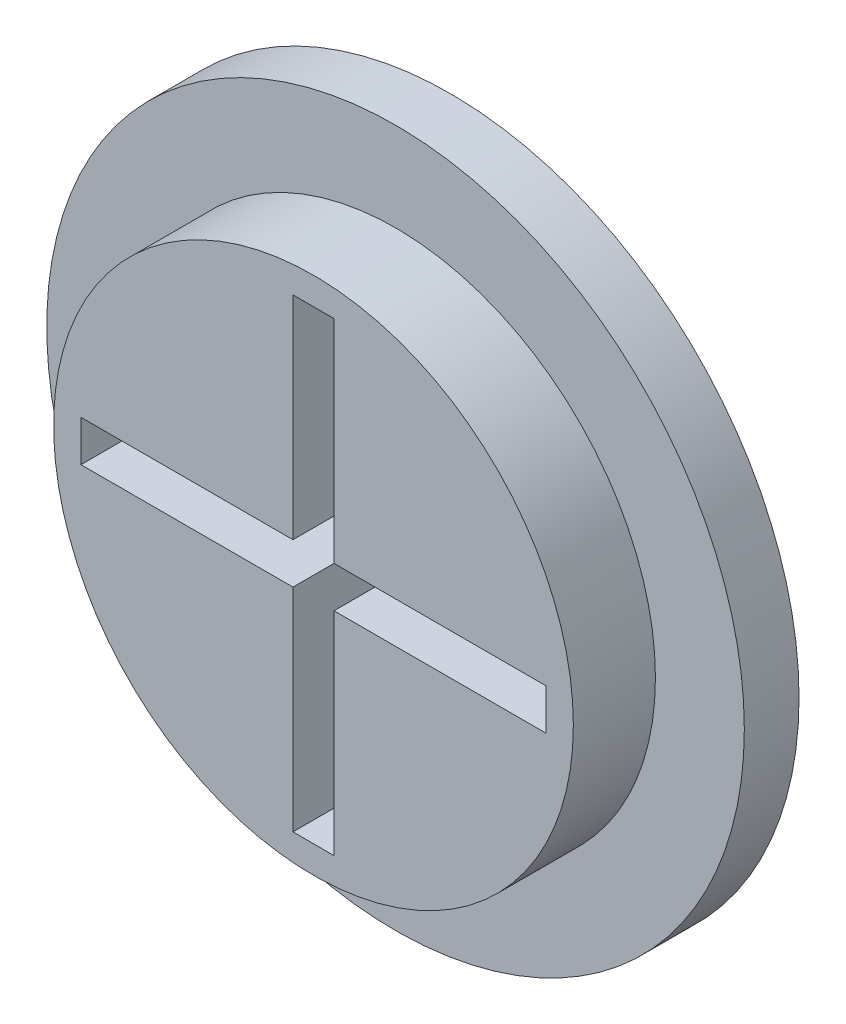
ISO-10303-21;
HEADER;
FILE_DESCRIPTION(('STEP AP214'),'2;1');
FILE_NAME('part.step','',(''),(''),'','','');
FILE_SCHEMA(('AUTOMOTIVE_DESIGN { 1 0 10303 214 1 1 1 1 }'));
ENDSEC;
DATA;
#1=APPLICATION_CONTEXT('core data for automotive mechanical design processes');
#2=APPLICATION_PROTOCOL_DEFINITION('international standard','automotive_design',2000,#1);
#3=PRODUCT_CONTEXT('',#1,'mechanical');
#4=PRODUCT('Part','Part','',(#3));
#5=PRODUCT_RELATED_PRODUCT_CATEGORY('part','',(#4));
#6=PRODUCT_DEFINITION_FORMATION('','',#4);
#7=PRODUCT_DEFINITION_CONTEXT('part definition',#1,'design');
#8=PRODUCT_DEFINITION('design','',#6,#7);
#9=PRODUCT_DEFINITION_SHAPE('','',#8);
#10=(LENGTH_UNIT() NAMED_UNIT(*) SI_UNIT(.MILLI.,.METRE.));
#11=(NAMED_UNIT(*) PLANE_ANGLE_UNIT() SI_UNIT($,.RADIAN.));
#12=(NAMED_UNIT(*) SI_UNIT($,.STERADIAN.) SOLID_ANGLE_UNIT());
#13=UNCERTAINTY_MEASURE_WITH_UNIT(LENGTH_MEASURE(1.E-05),#10,'distance_accuracy_value','');
#14=(GEOMETRIC_REPRESENTATION_CONTEXT(3) GLOBAL_UNCERTAINTY_ASSIGNED_CONTEXT((#13)) GLOBAL_UNIT_ASSIGNED_CONTEXT((#10,
#11,#12)) REPRESENTATION_CONTEXT('',''));
#15=CARTESIAN_POINT('',(0.,0.,0.));
#16=DIRECTION('',(0.,0.,1.));
#17=DIRECTION('',(1.,0.,0.));
#18=AXIS2_PLACEMENT_3D('',#15,#16,#17);
#19=CARTESIAN_POINT('',(0.,0.,2.));
#20=DIRECTION('',(0.,0.,-1.));
#21=DIRECTION('',(-1.,0.,0.));
#22=AXIS2_PLACEMENT_3D('',#19,#20,#21);
#23=CYLINDRICAL_SURFACE('',#22,12.75);
#24=CARTESIAN_POINT('',(0.,0.,2.));
#25=DIRECTION('',(0.,0.,1.));
#26=DIRECTION('',(1.,0.,0.));
#27=AXIS2_PLACEMENT_3D('',#24,#25,#26);
#28=CIRCLE('',#27,12.75);
#29=CARTESIAN_POINT('',(12.75,0.,2.));
#30=VERTEX_POINT('',#29);
#31=EDGE_CURVE('E45',#30,#30,#28,.T.);
#32=ORIENTED_EDGE('',*,*,#31,.F.);
#33=EDGE_LOOP('',(#32));
#34=FACE_BOUND('',#33,.T.);
#35=CARTESIAN_POINT('',(0.,0.,0.));
#36=DIRECTION('',(0.,0.,1.));
#37=DIRECTION('',(1.,0.,0.));
#38=AXIS2_PLACEMENT_3D('',#35,#36,#37);
#39=CIRCLE('',#38,12.75);
#40=CARTESIAN_POINT('',(12.75,0.,0.));
#41=VERTEX_POINT('',#40);
#42=EDGE_CURVE('E40',#41,#41,#39,.T.);
#43=ORIENTED_EDGE('',*,*,#42,.T.);
#44=EDGE_LOOP('',(#43));
#45=FACE_BOUND('',#44,.T.);
#46=ADVANCED_FACE('F37',(#34,#45),#23,.T.);
#47=CARTESIAN_POINT('',(0.,0.,2.));
#48=DIRECTION('',(0.,0.,1.));
#49=DIRECTION('',(1.,0.,0.));
#50=AXIS2_PLACEMENT_3D('',#47,#48,#49);
#51=PLANE('',#50);
#52=CARTESIAN_POINT('',(0.,0.,2.));
#53=DIRECTION('',(0.,0.,1.));
#54=DIRECTION('',(1.,0.,0.));
#55=AXIS2_PLACEMENT_3D('',#52,#53,#54);
#56=CIRCLE('',#55,9.5);
#57=CARTESIAN_POINT('',(9.5,0.,2.));
#58=VERTEX_POINT('',#57);
#59=EDGE_CURVE('E11',#58,#58,#56,.T.);
#60=ORIENTED_EDGE('',*,*,#59,.F.);
#61=EDGE_LOOP('',(#60));
#62=FACE_BOUND('',#61,.T.);
#63=ORIENTED_EDGE('',*,*,#31,.T.);
#64=EDGE_LOOP('',(#63));
#65=FACE_BOUND('',#64,.T.);
#66=ADVANCED_FACE('F233',(#62,#65),#51,.T.);
#67=CARTESIAN_POINT('',(0.,0.,0.));
#68=DIRECTION('',(0.,0.,1.));
#69=DIRECTION('',(1.,0.,0.));
#70=AXIS2_PLACEMENT_3D('',#67,#68,#69);
#71=PLANE('',#70);
#72=DIRECTION('',(0.,-1.,0.));
#73=VECTOR('',#72,1.);
#74=CARTESIAN_POINT('',(-8.5,0.,0.));
#75=LINE('',#74,#73);
#76=CARTESIAN_POINT('',(-8.5,0.75,0.));
#77=VERTEX_POINT('',#76);
#78=CARTESIAN_POINT('',(-8.5,-0.75,0.));
#79=VERTEX_POINT('',#78);
#80=EDGE_CURVE('E136',#77,#79,#75,.T.);
#81=ORIENTED_EDGE('',*,*,#80,.T.);
#82=DIRECTION('',(1.,0.,0.));
#83=VECTOR('',#82,1.);
#84=CARTESIAN_POINT('',(0.,-0.75,0.));
#85=LINE('',#84,#83);
#86=CARTESIAN_POINT('',(-0.749999999999999,-0.75,0.));
#87=VERTEX_POINT('',#86);
#88=EDGE_CURVE('E130',#79,#87,#85,.T.);
#89=ORIENTED_EDGE('',*,*,#88,.T.);
#90=DIRECTION('',(0.,-1.,0.));
#91=VECTOR('',#90,1.);
#92=CARTESIAN_POINT('',(-0.749999999999999,0.,0.));
#93=LINE('',#92,#91);
#94=CARTESIAN_POINT('',(-0.749999999999998,-8.5,0.));
#95=VERTEX_POINT('',#94);
#96=EDGE_CURVE('E139',#87,#95,#93,.T.);
#97=ORIENTED_EDGE('',*,*,#96,.T.);
#98=DIRECTION('',(1.,0.,0.));
#99=VECTOR('',#98,1.);
#100=CARTESIAN_POINT('',(0.,-8.5,0.));
#101=LINE('',#100,#99);
#102=CARTESIAN_POINT('',(0.750000000000002,-8.5,0.));
#103=VERTEX_POINT('',#102);
#104=EDGE_CURVE('E53',#95,#103,#101,.T.);
#105=ORIENTED_EDGE('',*,*,#104,.T.);
#106=DIRECTION('',(0.,-1.,0.));
#107=VECTOR('',#106,1.);
#108=CARTESIAN_POINT('',(0.750000000000001,0.,0.));
#109=LINE('',#108,#107);
#110=CARTESIAN_POINT('',(0.750000000000001,-0.75,0.));
#111=VERTEX_POINT('',#110);
#112=EDGE_CURVE('E154',#111,#103,#109,.T.);
#113=ORIENTED_EDGE('',*,*,#112,.F.);
#114=DIRECTION('',(1.,0.,0.));
#115=VECTOR('',#114,1.);
#116=CARTESIAN_POINT('',(0.,-0.75,0.));
#117=LINE('',#116,#115);
#118=CARTESIAN_POINT('',(8.5,-0.75,0.));
#119=VERTEX_POINT('',#118);
#120=EDGE_CURVE('E156',#111,#119,#117,.T.);
#121=ORIENTED_EDGE('',*,*,#120,.T.);
#122=DIRECTION('',(0.,-1.,0.));
#123=VECTOR('',#122,1.);
#124=CARTESIAN_POINT('',(8.5,0.,0.));
#125=LINE('',#124,#123);
#126=CARTESIAN_POINT('',(8.5,0.75,0.));
#127=VERTEX_POINT('',#126);
#128=EDGE_CURVE('E159',#127,#119,#125,.T.);
#129=ORIENTED_EDGE('',*,*,#128,.F.);
#130=DIRECTION('',(1.,0.,0.));
#131=VECTOR('',#130,1.);
#132=CARTESIAN_POINT('',(0.,0.75,0.));
#133=LINE('',#132,#131);
#134=CARTESIAN_POINT('',(0.750000000000001,0.75,0.));
#135=VERTEX_POINT('',#134);
#136=EDGE_CURVE('E161',#135,#127,#133,.T.);
#137=ORIENTED_EDGE('',*,*,#136,.F.);
#138=DIRECTION('',(0.,-1.,0.));
#139=VECTOR('',#138,1.);
#140=CARTESIAN_POINT('',(0.750000000000001,0.,0.));
#141=LINE('',#140,#139);
#142=CARTESIAN_POINT('',(0.75,8.5,0.));
#143=VERTEX_POINT('',#142);
#144=EDGE_CURVE('E163',#143,#135,#141,.T.);
#145=ORIENTED_EDGE('',*,*,#144,.F.);
#146=DIRECTION('',(1.,0.,0.));
#147=VECTOR('',#146,1.);
#148=CARTESIAN_POINT('',(0.,8.5,0.));
#149=LINE('',#148,#147);
#150=CARTESIAN_POINT('',(-0.75,8.5,0.));
#151=VERTEX_POINT('',#150);
#152=EDGE_CURVE('E165',#151,#143,#149,.T.);
#153=ORIENTED_EDGE('',*,*,#152,.F.);
#154=DIRECTION('',(0.,-1.,0.));
#155=VECTOR('',#154,1.);
#156=CARTESIAN_POINT('',(-0.749999999999999,0.,0.));
#157=LINE('',#156,#155);
#158=CARTESIAN_POINT('',(-0.749999999999999,0.75,0.));
#159=VERTEX_POINT('',#158);
#160=EDGE_CURVE('E167',#151,#159,#157,.T.);
#161=ORIENTED_EDGE('',*,*,#160,.T.);
#162=DIRECTION('',(1.,0.,0.));
#163=VECTOR('',#162,1.);
#164=CARTESIAN_POINT('',(0.,0.75,0.));
#165=LINE('',#164,#163);
#166=EDGE_CURVE('E170',#77,#159,#165,.T.);
#167=ORIENTED_EDGE('',*,*,#166,.F.);
#168=EDGE_LOOP('',(#81,#89,#97,#105,#113,#121,#129,#137,#145,#153,#161,#167));
#169=FACE_BOUND('',#168,.T.);
#170=ORIENTED_EDGE('',*,*,#42,.F.);
#171=EDGE_LOOP('',(#170));
#172=FACE_BOUND('',#171,.T.);
#173=ADVANCED_FACE('F143',(#169,#172),#71,.F.);
#174=CARTESIAN_POINT('',(0.,0.,5.));
#175=DIRECTION('',(0.,0.,-1.));
#176=DIRECTION('',(-1.,0.,0.));
#177=AXIS2_PLACEMENT_3D('',#174,#175,#176);
#178=CYLINDRICAL_SURFACE('',#177,9.5);
#179=CARTESIAN_POINT('',(0.,0.,5.));
#180=DIRECTION('',(0.,0.,1.));
#181=DIRECTION('',(1.,0.,0.));
#182=AXIS2_PLACEMENT_3D('',#179,#180,#181);
#183=CIRCLE('',#182,9.5);
#184=CARTESIAN_POINT('',(9.5,0.,5.));
#185=VERTEX_POINT('',#184);
#186=EDGE_CURVE('E204',#185,#185,#183,.T.);
#187=ORIENTED_EDGE('',*,*,#186,.F.);
#188=EDGE_LOOP('',(#187));
#189=FACE_BOUND('',#188,.T.);
#190=ORIENTED_EDGE('',*,*,#59,.T.);
#191=EDGE_LOOP('',(#190));
#192=FACE_BOUND('',#191,.T.);
#193=ADVANCED_FACE('F232',(#189,#192),#178,.T.);
#194=CARTESIAN_POINT('',(0.,0.,5.));
#195=DIRECTION('',(0.,0.,1.));
#196=DIRECTION('',(1.,0.,0.));
#197=AXIS2_PLACEMENT_3D('',#194,#195,#196);
#198=PLANE('',#197);
#199=DIRECTION('',(1.,0.,0.));
#200=VECTOR('',#199,1.);
#201=CARTESIAN_POINT('',(0.,-0.75,5.));
#202=LINE('',#201,#200);
#203=CARTESIAN_POINT('',(-8.5,-0.75,5.));
#204=VERTEX_POINT('',#203);
#205=CARTESIAN_POINT('',(-0.749999999999998,-0.75,5.));
#206=VERTEX_POINT('',#205);
#207=EDGE_CURVE('E61',#204,#206,#202,.T.);
#208=ORIENTED_EDGE('',*,*,#207,.F.);
#209=DIRECTION('',(0.,-1.,0.));
#210=VECTOR('',#209,1.);
#211=CARTESIAN_POINT('',(-8.5,0.,5.));
#212=LINE('',#211,#210);
#213=CARTESIAN_POINT('',(-8.5,0.75,5.));
#214=VERTEX_POINT('',#213);
#215=EDGE_CURVE('E147',#214,#204,#212,.T.);
#216=ORIENTED_EDGE('',*,*,#215,.F.);
#217=DIRECTION('',(1.,0.,0.));
#218=VECTOR('',#217,1.);
#219=CARTESIAN_POINT('',(0.,0.75,5.));
#220=LINE('',#219,#218);
#221=CARTESIAN_POINT('',(-0.749999999999999,0.75,5.));
#222=VERTEX_POINT('',#221);
#223=EDGE_CURVE('E150',#214,#222,#220,.T.);
#224=ORIENTED_EDGE('',*,*,#223,.T.);
#225=DIRECTION('',(0.,-1.,0.));
#226=VECTOR('',#225,1.);
#227=CARTESIAN_POINT('',(-0.749999999999999,0.,5.));
#228=LINE('',#227,#226);
#229=CARTESIAN_POINT('',(-0.75,8.5,5.));
#230=VERTEX_POINT('',#229);
#231=EDGE_CURVE('E197',#230,#222,#228,.T.);
#232=ORIENTED_EDGE('',*,*,#231,.F.);
#233=DIRECTION('',(1.,0.,0.));
#234=VECTOR('',#233,1.);
#235=CARTESIAN_POINT('',(0.,8.5,5.));
#236=LINE('',#235,#234);
#237=CARTESIAN_POINT('',(0.75,8.5,5.));
#238=VERTEX_POINT('',#237);
#239=EDGE_CURVE('E194',#230,#238,#236,.T.);
#240=ORIENTED_EDGE('',*,*,#239,.T.);
#241=DIRECTION('',(0.,-1.,0.));
#242=VECTOR('',#241,1.);
#243=CARTESIAN_POINT('',(0.750000000000001,0.,5.));
#244=LINE('',#243,#242);
#245=CARTESIAN_POINT('',(0.750000000000001,0.75,5.));
#246=VERTEX_POINT('',#245);
#247=EDGE_CURVE('E191',#238,#246,#244,.T.);
#248=ORIENTED_EDGE('',*,*,#247,.T.);
#249=DIRECTION('',(1.,0.,0.));
#250=VECTOR('',#249,1.);
#251=CARTESIAN_POINT('',(0.,0.75,5.));
#252=LINE('',#251,#250);
#253=CARTESIAN_POINT('',(8.5,0.75,5.));
#254=VERTEX_POINT('',#253);
#255=EDGE_CURVE('E188',#246,#254,#252,.T.);
#256=ORIENTED_EDGE('',*,*,#255,.T.);
#257=DIRECTION('',(0.,-1.,0.));
#258=VECTOR('',#257,1.);
#259=CARTESIAN_POINT('',(8.5,0.,5.));
#260=LINE('',#259,#258);
#261=CARTESIAN_POINT('',(8.5,-0.75,5.));
#262=VERTEX_POINT('',#261);
#263=EDGE_CURVE('E185',#254,#262,#260,.T.);
#264=ORIENTED_EDGE('',*,*,#263,.T.);
#265=DIRECTION('',(1.,0.,0.));
#266=VECTOR('',#265,1.);
#267=CARTESIAN_POINT('',(0.,-0.75,5.));
#268=LINE('',#267,#266);
#269=CARTESIAN_POINT('',(0.750000000000001,-0.75,5.));
#270=VERTEX_POINT('',#269);
#271=EDGE_CURVE('E182',#270,#262,#268,.T.);
#272=ORIENTED_EDGE('',*,*,#271,.F.);
#273=DIRECTION('',(0.,-1.,0.));
#274=VECTOR('',#273,1.);
#275=CARTESIAN_POINT('',(0.750000000000001,0.,5.));
#276=LINE('',#275,#274);
#277=CARTESIAN_POINT('',(0.750000000000002,-8.5,5.));
#278=VERTEX_POINT('',#277);
#279=EDGE_CURVE('E179',#270,#278,#276,.T.);
#280=ORIENTED_EDGE('',*,*,#279,.T.);
#281=DIRECTION('',(1.,0.,0.));
#282=VECTOR('',#281,1.);
#283=CARTESIAN_POINT('',(0.,-8.5,5.));
#284=LINE('',#283,#282);
#285=CARTESIAN_POINT('',(-0.749999999999998,-8.5,5.));
#286=VERTEX_POINT('',#285);
#287=EDGE_CURVE('E176',#286,#278,#284,.T.);
#288=ORIENTED_EDGE('',*,*,#287,.F.);
#289=DIRECTION('',(0.,-1.,0.));
#290=VECTOR('',#289,1.);
#291=CARTESIAN_POINT('',(-0.749999999999999,0.,5.));
#292=LINE('',#291,#290);
#293=EDGE_CURVE('E174',#206,#286,#292,.T.);
#294=ORIENTED_EDGE('',*,*,#293,.F.);
#295=EDGE_LOOP('',(#208,#216,#224,#232,#240,#248,#256,#264,#272,#280,#288,#294));
#296=FACE_BOUND('',#295,.T.);
#297=ORIENTED_EDGE('',*,*,#186,.T.);
#298=EDGE_LOOP('',(#297));
#299=FACE_BOUND('',#298,.T.);
#300=ADVANCED_FACE('F239',(#296,#299),#198,.T.);
#301=CARTESIAN_POINT('',(0.,-0.75,0.));
#302=DIRECTION('',(0.,-1.,0.));
#303=DIRECTION('',(0.,0.,-1.));
#304=AXIS2_PLACEMENT_3D('',#301,#302,#303);
#305=PLANE('',#304);
#306=ORIENTED_EDGE('',*,*,#207,.T.);
#307=DIRECTION('',(0.,0.,1.));
#308=VECTOR('',#307,1.);
#309=CARTESIAN_POINT('',(-0.749999999999999,-0.75,0.));
#310=LINE('',#309,#308);
#311=EDGE_CURVE('E126',#87,#206,#310,.T.);
#312=ORIENTED_EDGE('',*,*,#311,.F.);
#313=ORIENTED_EDGE('',*,*,#88,.F.);
#314=DIRECTION('',(0.,0.,1.));
#315=VECTOR('',#314,1.);
#316=CARTESIAN_POINT('',(-8.5,-0.75,0.));
#317=LINE('',#316,#315);
#318=EDGE_CURVE('E202',#79,#204,#317,.T.);
#319=ORIENTED_EDGE('',*,*,#318,.T.);
#320=EDGE_LOOP('',(#306,#312,#313,#319));
#321=FACE_BOUND('',#320,.T.);
#322=ADVANCED_FACE('F128',(#321),#305,.F.);
#323=CARTESIAN_POINT('',(-8.5,0.,0.));
#324=DIRECTION('',(-1.,0.,0.));
#325=DIRECTION('',(0.,0.,1.));
#326=AXIS2_PLACEMENT_3D('',#323,#324,#325);
#327=PLANE('',#326);
#328=ORIENTED_EDGE('',*,*,#215,.T.);
#329=ORIENTED_EDGE('',*,*,#318,.F.);
#330=ORIENTED_EDGE('',*,*,#80,.F.);
#331=DIRECTION('',(0.,0.,1.));
#332=VECTOR('',#331,1.);
#333=CARTESIAN_POINT('',(-8.5,0.75,0.));
#334=LINE('',#333,#332);
#335=EDGE_CURVE('E205',#77,#214,#334,.T.);
#336=ORIENTED_EDGE('',*,*,#335,.T.);
#337=EDGE_LOOP('',(#328,#329,#330,#336));
#338=FACE_BOUND('',#337,.T.);
#339=ADVANCED_FACE('F277',(#338),#327,.F.);
#340=CARTESIAN_POINT('',(0.,0.75,0.));
#341=DIRECTION('',(0.,-1.,0.));
#342=DIRECTION('',(0.,0.,-1.));
#343=AXIS2_PLACEMENT_3D('',#340,#341,#342);
#344=PLANE('',#343);
#345=ORIENTED_EDGE('',*,*,#223,.F.);
#346=ORIENTED_EDGE('',*,*,#335,.F.);
#347=ORIENTED_EDGE('',*,*,#166,.T.);
#348=DIRECTION('',(0.,0.,1.));
#349=VECTOR('',#348,1.);
#350=CARTESIAN_POINT('',(-0.749999999999999,0.75,0.));
#351=LINE('',#350,#349);
#352=EDGE_CURVE('E207',#159,#222,#351,.T.);
#353=ORIENTED_EDGE('',*,*,#352,.T.);
#354=EDGE_LOOP('',(#345,#346,#347,#353));
#355=FACE_BOUND('',#354,.T.);
#356=ADVANCED_FACE('F283',(#355),#344,.T.);
#357=CARTESIAN_POINT('',(-0.749999999999999,0.,0.));
#358=DIRECTION('',(-1.,0.,0.));
#359=DIRECTION('',(0.,-1.,0.));
#360=AXIS2_PLACEMENT_3D('',#357,#358,#359);
#361=PLANE('',#360);
#362=ORIENTED_EDGE('',*,*,#231,.T.);
#363=ORIENTED_EDGE('',*,*,#352,.F.);
#364=ORIENTED_EDGE('',*,*,#160,.F.);
#365=DIRECTION('',(0.,0.,1.));
#366=VECTOR('',#365,1.);
#367=CARTESIAN_POINT('',(-0.75,8.5,0.));
#368=LINE('',#367,#366);
#369=EDGE_CURVE('E209',#151,#230,#368,.T.);
#370=ORIENTED_EDGE('',*,*,#369,.T.);
#371=EDGE_LOOP('',(#362,#363,#364,#370));
#372=FACE_BOUND('',#371,.T.);
#373=ADVANCED_FACE('F291',(#372),#361,.F.);
#374=CARTESIAN_POINT('',(0.,8.5,0.));
#375=DIRECTION('',(0.,-1.,0.));
#376=DIRECTION('',(0.,0.,-1.));
#377=AXIS2_PLACEMENT_3D('',#374,#375,#376);
#378=PLANE('',#377);
#379=ORIENTED_EDGE('',*,*,#239,.F.);
#380=ORIENTED_EDGE('',*,*,#369,.F.);
#381=ORIENTED_EDGE('',*,*,#152,.T.);
#382=DIRECTION('',(0.,0.,1.));
#383=VECTOR('',#382,1.);
#384=CARTESIAN_POINT('',(0.75,8.5,0.));
#385=LINE('',#384,#383);
#386=EDGE_CURVE('E211',#143,#238,#385,.T.);
#387=ORIENTED_EDGE('',*,*,#386,.T.);
#388=EDGE_LOOP('',(#379,#380,#381,#387));
#389=FACE_BOUND('',#388,.T.);
#390=ADVANCED_FACE('F299',(#389),#378,.T.);
#391=CARTESIAN_POINT('',(0.750000000000001,0.,0.));
#392=DIRECTION('',(-1.,0.,0.));
#393=DIRECTION('',(0.,-1.,0.));
#394=AXIS2_PLACEMENT_3D('',#391,#392,#393);
#395=PLANE('',#394);
#396=ORIENTED_EDGE('',*,*,#247,.F.);
#397=ORIENTED_EDGE('',*,*,#386,.F.);
#398=ORIENTED_EDGE('',*,*,#144,.T.);
#399=DIRECTION('',(0.,0.,1.));
#400=VECTOR('',#399,1.);
#401=CARTESIAN_POINT('',(0.750000000000001,0.75,0.));
#402=LINE('',#401,#400);
#403=EDGE_CURVE('E213',#135,#246,#402,.T.);
#404=ORIENTED_EDGE('',*,*,#403,.T.);
#405=EDGE_LOOP('',(#396,#397,#398,#404));
#406=FACE_BOUND('',#405,.T.);
#407=ADVANCED_FACE('F307',(#406),#395,.T.);
#408=CARTESIAN_POINT('',(0.,0.75,0.));
#409=DIRECTION('',(0.,-1.,0.));
#410=DIRECTION('',(0.,0.,-1.));
#411=AXIS2_PLACEMENT_3D('',#408,#409,#410);
#412=PLANE('',#411);
#413=ORIENTED_EDGE('',*,*,#255,.F.);
#414=ORIENTED_EDGE('',*,*,#403,.F.);
#415=ORIENTED_EDGE('',*,*,#136,.T.);
#416=DIRECTION('',(0.,0.,1.));
#417=VECTOR('',#416,1.);
#418=CARTESIAN_POINT('',(8.5,0.75,0.));
#419=LINE('',#418,#417);
#420=EDGE_CURVE('E215',#127,#254,#419,.T.);
#421=ORIENTED_EDGE('',*,*,#420,.T.);
#422=EDGE_LOOP('',(#413,#414,#415,#421));
#423=FACE_BOUND('',#422,.T.);
#424=ADVANCED_FACE('F315',(#423),#412,.T.);
#425=CARTESIAN_POINT('',(8.5,0.,0.));
#426=DIRECTION('',(-1.,0.,0.));
#427=DIRECTION('',(0.,0.,1.));
#428=AXIS2_PLACEMENT_3D('',#425,#426,#427);
#429=PLANE('',#428);
#430=ORIENTED_EDGE('',*,*,#263,.F.);
#431=ORIENTED_EDGE('',*,*,#420,.F.);
#432=ORIENTED_EDGE('',*,*,#128,.T.);
#433=DIRECTION('',(0.,0.,1.));
#434=VECTOR('',#433,1.);
#435=CARTESIAN_POINT('',(8.5,-0.75,0.));
#436=LINE('',#435,#434);
#437=EDGE_CURVE('E217',#119,#262,#436,.T.);
#438=ORIENTED_EDGE('',*,*,#437,.T.);
#439=EDGE_LOOP('',(#430,#431,#432,#438));
#440=FACE_BOUND('',#439,.T.);
#441=ADVANCED_FACE('F323',(#440),#429,.T.);
#442=CARTESIAN_POINT('',(0.,-0.75,0.));
#443=DIRECTION('',(0.,-1.,0.));
#444=DIRECTION('',(0.,0.,-1.));
#445=AXIS2_PLACEMENT_3D('',#442,#443,#444);
#446=PLANE('',#445);
#447=ORIENTED_EDGE('',*,*,#271,.T.);
#448=ORIENTED_EDGE('',*,*,#437,.F.);
#449=ORIENTED_EDGE('',*,*,#120,.F.);
#450=DIRECTION('',(0.,0.,1.));
#451=VECTOR('',#450,1.);
#452=CARTESIAN_POINT('',(0.750000000000001,-0.75,0.));
#453=LINE('',#452,#451);
#454=EDGE_CURVE('E219',#111,#270,#453,.T.);
#455=ORIENTED_EDGE('',*,*,#454,.T.);
#456=EDGE_LOOP('',(#447,#448,#449,#455));
#457=FACE_BOUND('',#456,.T.);
#458=ADVANCED_FACE('F331',(#457),#446,.F.);
#459=CARTESIAN_POINT('',(0.750000000000001,0.,0.));
#460=DIRECTION('',(-1.,0.,0.));
#461=DIRECTION('',(0.,-1.,0.));
#462=AXIS2_PLACEMENT_3D('',#459,#460,#461);
#463=PLANE('',#462);
#464=ORIENTED_EDGE('',*,*,#279,.F.);
#465=ORIENTED_EDGE('',*,*,#454,.F.);
#466=ORIENTED_EDGE('',*,*,#112,.T.);
#467=DIRECTION('',(0.,0.,1.));
#468=VECTOR('',#467,1.);
#469=CARTESIAN_POINT('',(0.750000000000002,-8.5,0.));
#470=LINE('',#469,#468);
#471=EDGE_CURVE('E221',#103,#278,#470,.T.);
#472=ORIENTED_EDGE('',*,*,#471,.T.);
#473=EDGE_LOOP('',(#464,#465,#466,#472));
#474=FACE_BOUND('',#473,.T.);
#475=ADVANCED_FACE('F339',(#474),#463,.T.);
#476=CARTESIAN_POINT('',(0.,-8.5,0.));
#477=DIRECTION('',(0.,-1.,0.));
#478=DIRECTION('',(0.,0.,-1.));
#479=AXIS2_PLACEMENT_3D('',#476,#477,#478);
#480=PLANE('',#479);
#481=ORIENTED_EDGE('',*,*,#287,.T.);
#482=ORIENTED_EDGE('',*,*,#471,.F.);
#483=ORIENTED_EDGE('',*,*,#104,.F.);
#484=DIRECTION('',(0.,0.,1.));
#485=VECTOR('',#484,1.);
#486=CARTESIAN_POINT('',(-0.749999999999998,-8.5,0.));
#487=LINE('',#486,#485);
#488=EDGE_CURVE('E135',#95,#286,#487,.T.);
#489=ORIENTED_EDGE('',*,*,#488,.T.);
#490=EDGE_LOOP('',(#481,#482,#483,#489));
#491=FACE_BOUND('',#490,.T.);
#492=ADVANCED_FACE('F347',(#491),#480,.F.);
#493=CARTESIAN_POINT('',(-0.749999999999999,0.,0.));
#494=DIRECTION('',(-1.,0.,0.));
#495=DIRECTION('',(0.,-1.,0.));
#496=AXIS2_PLACEMENT_3D('',#493,#494,#495);
#497=PLANE('',#496);
#498=ORIENTED_EDGE('',*,*,#293,.T.);
#499=ORIENTED_EDGE('',*,*,#488,.F.);
#500=ORIENTED_EDGE('',*,*,#96,.F.);
#501=ORIENTED_EDGE('',*,*,#311,.T.);
#502=EDGE_LOOP('',(#498,#499,#500,#501));
#503=FACE_BOUND('',#502,.T.);
#504=ADVANCED_FACE('F140',(#503),#497,.F.);
#505=CLOSED_SHELL('',(#46,#66,#173,#193,#300,#322,#339,#356,#373,#390,#407,#424,#441,#458,#475,
#492,#504));
#506=MANIFOLD_SOLID_BREP('B2',#505);
#507=ADVANCED_BREP_SHAPE_REPRESENTATION('',(#18,#506),#14);
#508=SHAPE_DEFINITION_REPRESENTATION(#9,#507);
ENDSEC;
END-ISO-10303-21;
